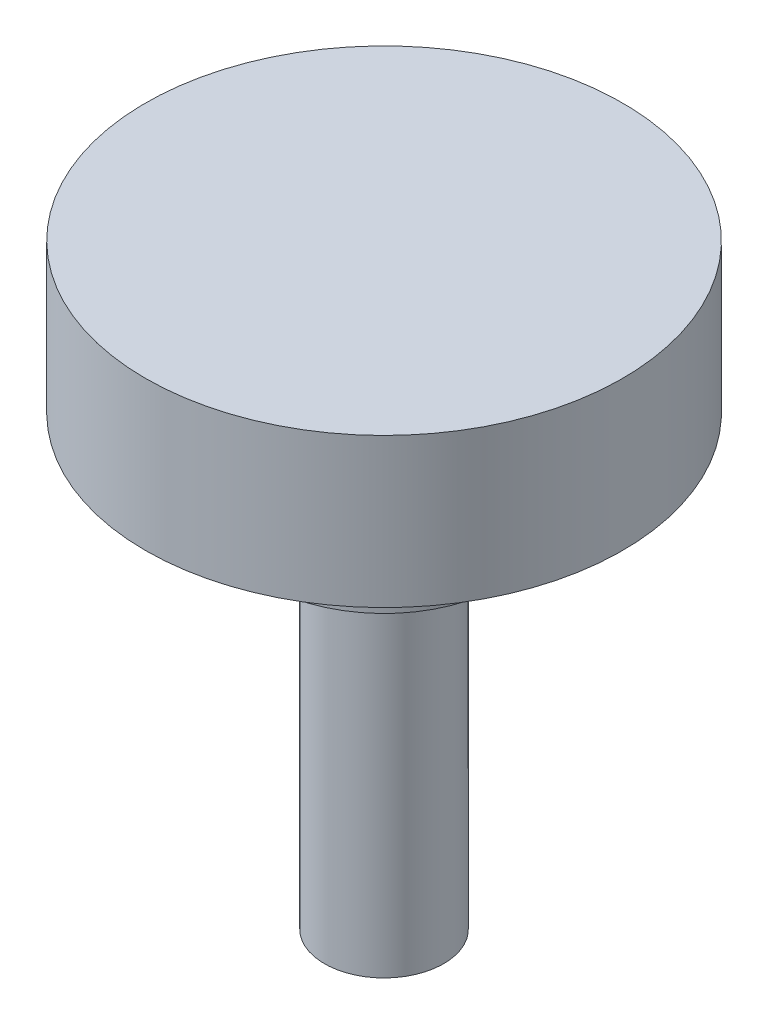
ISO-10303-21;
HEADER;
FILE_DESCRIPTION(('STEP AP214'),'2;1');
FILE_NAME('part.step','',(''),(''),'','','');
FILE_SCHEMA(('AUTOMOTIVE_DESIGN { 1 0 10303 214 1 1 1 1 }'));
ENDSEC;
DATA;
#1=APPLICATION_CONTEXT('core data for automotive mechanical design processes');
#2=APPLICATION_PROTOCOL_DEFINITION('international standard','automotive_design',2000,#1);
#3=PRODUCT_CONTEXT('',#1,'mechanical');
#4=PRODUCT('Part','Part','',(#3));
#5=PRODUCT_RELATED_PRODUCT_CATEGORY('part','',(#4));
#6=PRODUCT_DEFINITION_FORMATION('','',#4);
#7=PRODUCT_DEFINITION_CONTEXT('part definition',#1,'design');
#8=PRODUCT_DEFINITION('design','',#6,#7);
#9=PRODUCT_DEFINITION_SHAPE('','',#8);
#10=(LENGTH_UNIT() NAMED_UNIT(*) SI_UNIT(.MILLI.,.METRE.));
#11=(NAMED_UNIT(*) PLANE_ANGLE_UNIT() SI_UNIT($,.RADIAN.));
#12=(NAMED_UNIT(*) SI_UNIT($,.STERADIAN.) SOLID_ANGLE_UNIT());
#13=UNCERTAINTY_MEASURE_WITH_UNIT(LENGTH_MEASURE(1.E-05),#10,'distance_accuracy_value','');
#14=(GEOMETRIC_REPRESENTATION_CONTEXT(3) GLOBAL_UNCERTAINTY_ASSIGNED_CONTEXT((#13)) GLOBAL_UNIT_ASSIGNED_CONTEXT((#10,
#11,#12)) REPRESENTATION_CONTEXT('',''));
#15=CARTESIAN_POINT('',(0.,0.,0.));
#16=DIRECTION('',(0.,0.,1.));
#17=DIRECTION('',(1.,0.,0.));
#18=AXIS2_PLACEMENT_3D('',#15,#16,#17);
#19=CARTESIAN_POINT('',(0.,19.05,0.));
#20=DIRECTION('',(0.,-1.,0.));
#21=DIRECTION('',(0.,0.,-1.));
#22=AXIS2_PLACEMENT_3D('',#19,#20,#21);
#23=CYLINDRICAL_SURFACE('',#22,3.175);
#24=CARTESIAN_POINT('',(0.,19.05,0.));
#25=DIRECTION('',(0.,1.,0.));
#26=DIRECTION('',(0.,0.,1.));
#27=AXIS2_PLACEMENT_3D('',#24,#25,#26);
#28=CIRCLE('',#27,3.175);
#29=CARTESIAN_POINT('',(0.,19.05,-3.175));
#30=VERTEX_POINT('',#29);
#31=EDGE_CURVE('E10',#30,#30,#28,.T.);
#32=CARTESIAN_POINT('',(0.,0.,0.));
#33=DIRECTION('',(0.,1.,0.));
#34=DIRECTION('',(0.,0.,1.));
#35=AXIS2_PLACEMENT_3D('',#32,#33,#34);
#36=CIRCLE('',#35,3.175);
#37=CARTESIAN_POINT('',(0.,0.,-3.175));
#38=VERTEX_POINT('',#37);
#39=EDGE_CURVE('E34',#38,#38,#36,.T.);
#40=CARTESIAN_POINT('',(0.,19.05,-3.175));
#41=CARTESIAN_POINT('',(0.,18.8515625,-3.175));
#42=CARTESIAN_POINT('',(0.,18.653125,-3.175));
#43=CARTESIAN_POINT('',(0.,18.25625,-3.175));
#44=CARTESIAN_POINT('',(0.,18.0578125,-3.175));
#45=CARTESIAN_POINT('',(0.,17.6609375,-3.175));
#46=CARTESIAN_POINT('',(0.,17.4625,-3.175));
#47=CARTESIAN_POINT('',(0.,17.065625,-3.175));
#48=CARTESIAN_POINT('',(0.,16.8671875,-3.175));
#49=CARTESIAN_POINT('',(0.,16.4703125,-3.175));
#50=CARTESIAN_POINT('',(0.,16.271875,-3.175));
#51=CARTESIAN_POINT('',(0.,15.875,-3.175));
#52=CARTESIAN_POINT('',(0.,15.6765625,-3.175));
#53=CARTESIAN_POINT('',(0.,15.2796875,-3.175));
#54=CARTESIAN_POINT('',(0.,15.08125,-3.175));
#55=CARTESIAN_POINT('',(0.,14.684375,-3.175));
#56=CARTESIAN_POINT('',(0.,14.4859375,-3.175));
#57=CARTESIAN_POINT('',(0.,14.0890625,-3.175));
#58=CARTESIAN_POINT('',(0.,13.890625,-3.175));
#59=CARTESIAN_POINT('',(0.,13.49375,-3.175));
#60=CARTESIAN_POINT('',(0.,13.2953125,-3.175));
#61=CARTESIAN_POINT('',(0.,12.8984375,-3.175));
#62=CARTESIAN_POINT('',(0.,12.7,-3.175));
#63=CARTESIAN_POINT('',(0.,12.303125,-3.175));
#64=CARTESIAN_POINT('',(0.,12.1046875,-3.175));
#65=CARTESIAN_POINT('',(0.,11.7078125,-3.175));
#66=CARTESIAN_POINT('',(0.,11.509375,-3.175));
#67=CARTESIAN_POINT('',(0.,11.1125,-3.175));
#68=CARTESIAN_POINT('',(0.,10.9140625,-3.175));
#69=CARTESIAN_POINT('',(0.,10.5171875,-3.175));
#70=CARTESIAN_POINT('',(0.,10.31875,-3.175));
#71=CARTESIAN_POINT('',(0.,9.921875,-3.175));
#72=CARTESIAN_POINT('',(0.,9.7234375,-3.175));
#73=CARTESIAN_POINT('',(0.,9.3265625,-3.175));
#74=CARTESIAN_POINT('',(0.,9.128125,-3.175));
#75=CARTESIAN_POINT('',(0.,8.73125,-3.175));
#76=CARTESIAN_POINT('',(0.,8.5328125,-3.175));
#77=CARTESIAN_POINT('',(0.,8.1359375,-3.175));
#78=CARTESIAN_POINT('',(0.,7.9375,-3.175));
#79=CARTESIAN_POINT('',(0.,7.540625,-3.175));
#80=CARTESIAN_POINT('',(0.,7.3421875,-3.175));
#81=CARTESIAN_POINT('',(0.,6.9453125,-3.175));
#82=CARTESIAN_POINT('',(0.,6.746875,-3.175));
#83=CARTESIAN_POINT('',(0.,6.35,-3.175));
#84=CARTESIAN_POINT('',(0.,6.1515625,-3.175));
#85=CARTESIAN_POINT('',(0.,5.7546875,-3.175));
#86=CARTESIAN_POINT('',(0.,5.55625,-3.175));
#87=CARTESIAN_POINT('',(0.,5.159375,-3.175));
#88=CARTESIAN_POINT('',(0.,4.9609375,-3.175));
#89=CARTESIAN_POINT('',(0.,4.5640625,-3.175));
#90=CARTESIAN_POINT('',(0.,4.365625,-3.175));
#91=CARTESIAN_POINT('',(0.,3.96875,-3.175));
#92=CARTESIAN_POINT('',(0.,3.7703125,-3.175));
#93=CARTESIAN_POINT('',(0.,3.3734375,-3.175));
#94=CARTESIAN_POINT('',(0.,3.175,-3.175));
#95=CARTESIAN_POINT('',(0.,2.778125,-3.175));
#96=CARTESIAN_POINT('',(0.,2.5796875,-3.175));
#97=CARTESIAN_POINT('',(0.,2.1828125,-3.175));
#98=CARTESIAN_POINT('',(0.,1.984375,-3.175));
#99=CARTESIAN_POINT('',(0.,1.5875,-3.175));
#100=CARTESIAN_POINT('',(0.,1.3890625,-3.175));
#101=CARTESIAN_POINT('',(0.,0.992187500000001,-3.175));
#102=CARTESIAN_POINT('',(0.,0.793750000000001,-3.175));
#103=CARTESIAN_POINT('',(0.,0.396875,-3.175));
#104=CARTESIAN_POINT('',(0.,0.1984375,-3.175));
#105=CARTESIAN_POINT('',(0.,0.,-3.175));
#106=B_SPLINE_CURVE_WITH_KNOTS('',3,(#40,#41,#42,#43,#44,#45,#46,#47,#48,#49,#50,#51,#52,#53,
#54,#55,#56,#57,#58,#59,#60,#61,#62,#63,#64,#65,#66,#67,#68,#69,#70,#71,#72,#73,#74,#75,#76,#77,
#78,#79,#80,#81,#82,#83,#84,#85,#86,#87,#88,#89,#90,#91,#92,#93,#94,#95,#96,#97,#98,#99,#100,
#101,#102,#103,#104,#105),.UNSPECIFIED.,.F.,.F.,(4,2,2,2,2,2,2,2,2,2,2,2,2,2,2,2,2,2,2,2,2,2,2,
2,2,2,2,2,2,2,2,2,4),(0.,0.595312499999997,1.190625,1.7859375,2.38125,2.9765625,3.571875,
4.1671875,4.7625,5.3578125,5.953125,6.5484375,7.14375,7.7390625,8.334375,8.9296875,9.525,
10.1203125,10.715625,11.3109375,11.90625,12.5015625,13.096875,13.6921875,14.2875,14.8828125,
15.478125,16.0734375,16.66875,17.2640625,17.859375,18.4546875,19.05),.UNSPECIFIED.);
#107=EDGE_CURVE('BSEAM31',#30,#38,#106,.T.);
#108=ORIENTED_EDGE('',*,*,#31,.F.);
#109=ORIENTED_EDGE('',*,*,#39,.T.);
#110=ORIENTED_EDGE('',*,*,#107,.T.);
#111=ORIENTED_EDGE('',*,*,#107,.F.);
#112=EDGE_LOOP('',(#108,#110,#109,#111));
#113=FACE_BOUND('',#112,.T.);
#114=ADVANCED_FACE('F31',(#113),#23,.T.);
#115=CARTESIAN_POINT('',(0.,0.,0.));
#116=DIRECTION('',(0.,1.,0.));
#117=DIRECTION('',(0.,0.,1.));
#118=AXIS2_PLACEMENT_3D('',#115,#116,#117);
#119=PLANE('',#118);
#120=ORIENTED_EDGE('',*,*,#39,.F.);
#121=EDGE_LOOP('',(#120));
#122=FACE_BOUND('',#121,.T.);
#123=ADVANCED_FACE('F73',(#122),#119,.F.);
#124=CARTESIAN_POINT('',(0.,23.8125,0.));
#125=DIRECTION('',(0.,-1.,0.));
#126=DIRECTION('',(0.,0.,-1.));
#127=AXIS2_PLACEMENT_3D('',#124,#125,#126);
#128=CYLINDRICAL_SURFACE('',#127,6.35);
#129=CARTESIAN_POINT('',(0.,23.8125,0.));
#130=DIRECTION('',(0.,1.,0.));
#131=DIRECTION('',(0.,0.,1.));
#132=AXIS2_PLACEMENT_3D('',#129,#130,#131);
#133=CIRCLE('',#132,6.35);
#134=CARTESIAN_POINT('',(0.,23.8125,-6.35));
#135=VERTEX_POINT('',#134);
#136=EDGE_CURVE('E41',#135,#135,#133,.T.);
#137=CARTESIAN_POINT('',(0.,19.05,0.));
#138=DIRECTION('',(0.,1.,0.));
#139=DIRECTION('',(0.,0.,1.));
#140=AXIS2_PLACEMENT_3D('',#137,#138,#139);
#141=CIRCLE('',#140,6.35);
#142=CARTESIAN_POINT('',(0.,19.05,-6.35));
#143=VERTEX_POINT('',#142);
#144=EDGE_CURVE('E43',#143,#143,#141,.T.);
#145=CARTESIAN_POINT('',(0.,23.8125,-6.35));
#146=CARTESIAN_POINT('',(0.,23.762890625,-6.35));
#147=CARTESIAN_POINT('',(0.,23.71328125,-6.35));
#148=CARTESIAN_POINT('',(0.,23.6140625,-6.35));
#149=CARTESIAN_POINT('',(0.,23.564453125,-6.35));
#150=CARTESIAN_POINT('',(0.,23.465234375,-6.35));
#151=CARTESIAN_POINT('',(0.,23.415625,-6.35));
#152=CARTESIAN_POINT('',(0.,23.31640625,-6.35));
#153=CARTESIAN_POINT('',(0.,23.266796875,-6.35));
#154=CARTESIAN_POINT('',(0.,23.167578125,-6.35));
#155=CARTESIAN_POINT('',(0.,23.11796875,-6.35));
#156=CARTESIAN_POINT('',(0.,23.01875,-6.35));
#157=CARTESIAN_POINT('',(0.,22.969140625,-6.35));
#158=CARTESIAN_POINT('',(0.,22.869921875,-6.35));
#159=CARTESIAN_POINT('',(0.,22.8203125,-6.35));
#160=CARTESIAN_POINT('',(0.,22.72109375,-6.35));
#161=CARTESIAN_POINT('',(0.,22.671484375,-6.35));
#162=CARTESIAN_POINT('',(0.,22.572265625,-6.35));
#163=CARTESIAN_POINT('',(0.,22.52265625,-6.35));
#164=CARTESIAN_POINT('',(0.,22.4234375,-6.35));
#165=CARTESIAN_POINT('',(0.,22.373828125,-6.35));
#166=CARTESIAN_POINT('',(0.,22.274609375,-6.35));
#167=CARTESIAN_POINT('',(0.,22.225,-6.35));
#168=CARTESIAN_POINT('',(0.,22.12578125,-6.35));
#169=CARTESIAN_POINT('',(0.,22.076171875,-6.35));
#170=CARTESIAN_POINT('',(0.,21.976953125,-6.35));
#171=CARTESIAN_POINT('',(0.,21.92734375,-6.35));
#172=CARTESIAN_POINT('',(0.,21.828125,-6.35));
#173=CARTESIAN_POINT('',(0.,21.778515625,-6.35));
#174=CARTESIAN_POINT('',(0.,21.679296875,-6.35));
#175=CARTESIAN_POINT('',(0.,21.6296875,-6.35));
#176=CARTESIAN_POINT('',(0.,21.53046875,-6.35));
#177=CARTESIAN_POINT('',(0.,21.480859375,-6.35));
#178=CARTESIAN_POINT('',(0.,21.381640625,-6.35));
#179=CARTESIAN_POINT('',(0.,21.33203125,-6.35));
#180=CARTESIAN_POINT('',(0.,21.2328125,-6.35));
#181=CARTESIAN_POINT('',(0.,21.183203125,-6.35));
#182=CARTESIAN_POINT('',(0.,21.083984375,-6.35));
#183=CARTESIAN_POINT('',(0.,21.034375,-6.35));
#184=CARTESIAN_POINT('',(0.,20.93515625,-6.35));
#185=CARTESIAN_POINT('',(0.,20.885546875,-6.35));
#186=CARTESIAN_POINT('',(0.,20.786328125,-6.35));
#187=CARTESIAN_POINT('',(0.,20.73671875,-6.35));
#188=CARTESIAN_POINT('',(0.,20.6375,-6.35));
#189=CARTESIAN_POINT('',(0.,20.587890625,-6.35));
#190=CARTESIAN_POINT('',(0.,20.488671875,-6.35));
#191=CARTESIAN_POINT('',(0.,20.4390625,-6.35));
#192=CARTESIAN_POINT('',(0.,20.33984375,-6.35));
#193=CARTESIAN_POINT('',(0.,20.290234375,-6.35));
#194=CARTESIAN_POINT('',(0.,20.191015625,-6.35));
#195=CARTESIAN_POINT('',(0.,20.14140625,-6.35));
#196=CARTESIAN_POINT('',(0.,20.0421875,-6.35));
#197=CARTESIAN_POINT('',(0.,19.992578125,-6.35));
#198=CARTESIAN_POINT('',(0.,19.893359375,-6.35));
#199=CARTESIAN_POINT('',(0.,19.84375,-6.35));
#200=CARTESIAN_POINT('',(0.,19.74453125,-6.35));
#201=CARTESIAN_POINT('',(0.,19.694921875,-6.35));
#202=CARTESIAN_POINT('',(0.,19.595703125,-6.35));
#203=CARTESIAN_POINT('',(0.,19.54609375,-6.35));
#204=CARTESIAN_POINT('',(0.,19.446875,-6.35));
#205=CARTESIAN_POINT('',(0.,19.397265625,-6.35));
#206=CARTESIAN_POINT('',(0.,19.298046875,-6.35));
#207=CARTESIAN_POINT('',(0.,19.2484375,-6.35));
#208=CARTESIAN_POINT('',(0.,19.14921875,-6.35));
#209=CARTESIAN_POINT('',(0.,19.099609375,-6.35));
#210=CARTESIAN_POINT('',(0.,19.05,-6.35));
#211=B_SPLINE_CURVE_WITH_KNOTS('',3,(#145,#146,#147,#148,#149,#150,#151,#152,#153,#154,#155,
#156,#157,#158,#159,#160,#161,#162,#163,#164,#165,#166,#167,#168,#169,#170,#171,#172,#173,#174,
#175,#176,#177,#178,#179,#180,#181,#182,#183,#184,#185,#186,#187,#188,#189,#190,#191,#192,#193,
#194,#195,#196,#197,#198,#199,#200,#201,#202,#203,#204,#205,#206,#207,#208,#209,#210),
.UNSPECIFIED.,.F.,.F.,(4,2,2,2,2,2,2,2,2,2,2,2,2,2,2,2,2,2,2,2,2,2,2,2,2,2,2,2,2,2,2,2,4),(0.,
0.148828125,0.29765625,0.446484375,0.5953125,0.744140625,0.892968750000001,1.041796875,1.190625,
1.339453125,1.48828125,1.637109375,1.7859375,1.934765625,2.08359375,2.232421875,2.38125,
2.530078125,2.67890625,2.827734375,2.9765625,3.125390625,3.27421875,3.423046875,3.571875,
3.720703125,3.86953125,4.018359375,4.1671875,4.316015625,4.46484375,4.613671875,4.7625),.UNSPECIFIED.);
#212=EDGE_CURVE('BSEAM78',#135,#143,#211,.T.);
#213=ORIENTED_EDGE('',*,*,#136,.F.);
#214=ORIENTED_EDGE('',*,*,#144,.T.);
#215=ORIENTED_EDGE('',*,*,#212,.T.);
#216=ORIENTED_EDGE('',*,*,#212,.F.);
#217=EDGE_LOOP('',(#213,#215,#214,#216));
#218=FACE_BOUND('',#217,.T.);
#219=ADVANCED_FACE('F78',(#218),#128,.T.);
#220=CARTESIAN_POINT('',(0.,19.05,0.));
#221=DIRECTION('',(0.,1.,0.));
#222=DIRECTION('',(0.,0.,1.));
#223=AXIS2_PLACEMENT_3D('',#220,#221,#222);
#224=PLANE('',#223);
#225=ORIENTED_EDGE('',*,*,#31,.T.);
#226=EDGE_LOOP('',(#225));
#227=FACE_BOUND('',#226,.T.);
#228=ORIENTED_EDGE('',*,*,#144,.F.);
#229=EDGE_LOOP('',(#228));
#230=FACE_BOUND('',#229,.T.);
#231=ADVANCED_FACE('F60',(#227,#230),#224,.F.);
#232=CARTESIAN_POINT('',(0.,31.75,0.));
#233=DIRECTION('',(0.,-1.,0.));
#234=DIRECTION('',(0.,0.,-1.));
#235=AXIS2_PLACEMENT_3D('',#232,#233,#234);
#236=CYLINDRICAL_SURFACE('',#235,12.7);
#237=CARTESIAN_POINT('',(0.,31.75,0.));
#238=DIRECTION('',(0.,1.,0.));
#239=DIRECTION('',(0.,0.,1.));
#240=AXIS2_PLACEMENT_3D('',#237,#238,#239);
#241=CIRCLE('',#240,12.7);
#242=CARTESIAN_POINT('',(0.,31.75,12.7));
#243=VERTEX_POINT('',#242);
#244=EDGE_CURVE('E46',#243,#243,#241,.T.);
#245=ORIENTED_EDGE('',*,*,#244,.F.);
#246=EDGE_LOOP('',(#245));
#247=FACE_BOUND('',#246,.T.);
#248=CARTESIAN_POINT('',(0.,23.8125,0.));
#249=DIRECTION('',(0.,1.,0.));
#250=DIRECTION('',(0.,0.,1.));
#251=AXIS2_PLACEMENT_3D('',#248,#249,#250);
#252=CIRCLE('',#251,12.7);
#253=CARTESIAN_POINT('',(0.,23.8125,12.7));
#254=VERTEX_POINT('',#253);
#255=EDGE_CURVE('E49',#254,#254,#252,.T.);
#256=ORIENTED_EDGE('',*,*,#255,.T.);
#257=EDGE_LOOP('',(#256));
#258=FACE_BOUND('',#257,.T.);
#259=ADVANCED_FACE('F57',(#247,#258),#236,.T.);
#260=CARTESIAN_POINT('',(0.,31.75,0.));
#261=DIRECTION('',(0.,1.,0.));
#262=DIRECTION('',(0.,0.,1.));
#263=AXIS2_PLACEMENT_3D('',#260,#261,#262);
#264=PLANE('',#263);
#265=ORIENTED_EDGE('',*,*,#244,.T.);
#266=EDGE_LOOP('',(#265));
#267=FACE_BOUND('',#266,.T.);
#268=ADVANCED_FACE('F55',(#267),#264,.T.);
#269=CARTESIAN_POINT('',(0.,23.8125,0.));
#270=DIRECTION('',(0.,1.,0.));
#271=DIRECTION('',(0.,0.,1.));
#272=AXIS2_PLACEMENT_3D('',#269,#270,#271);
#273=PLANE('',#272);
#274=ORIENTED_EDGE('',*,*,#136,.T.);
#275=EDGE_LOOP('',(#274));
#276=FACE_BOUND('',#275,.T.);
#277=ORIENTED_EDGE('',*,*,#255,.F.);
#278=EDGE_LOOP('',(#277));
#279=FACE_BOUND('',#278,.T.);
#280=ADVANCED_FACE('F64',(#276,#279),#273,.F.);
#281=CLOSED_SHELL('',(#114,#123,#219,#231,#259,#268,#280));
#282=MANIFOLD_SOLID_BREP('B2',#281);
#283=ADVANCED_BREP_SHAPE_REPRESENTATION('',(#18,#282),#14);
#284=SHAPE_DEFINITION_REPRESENTATION(#9,#283);
ENDSEC;
END-ISO-10303-21;
